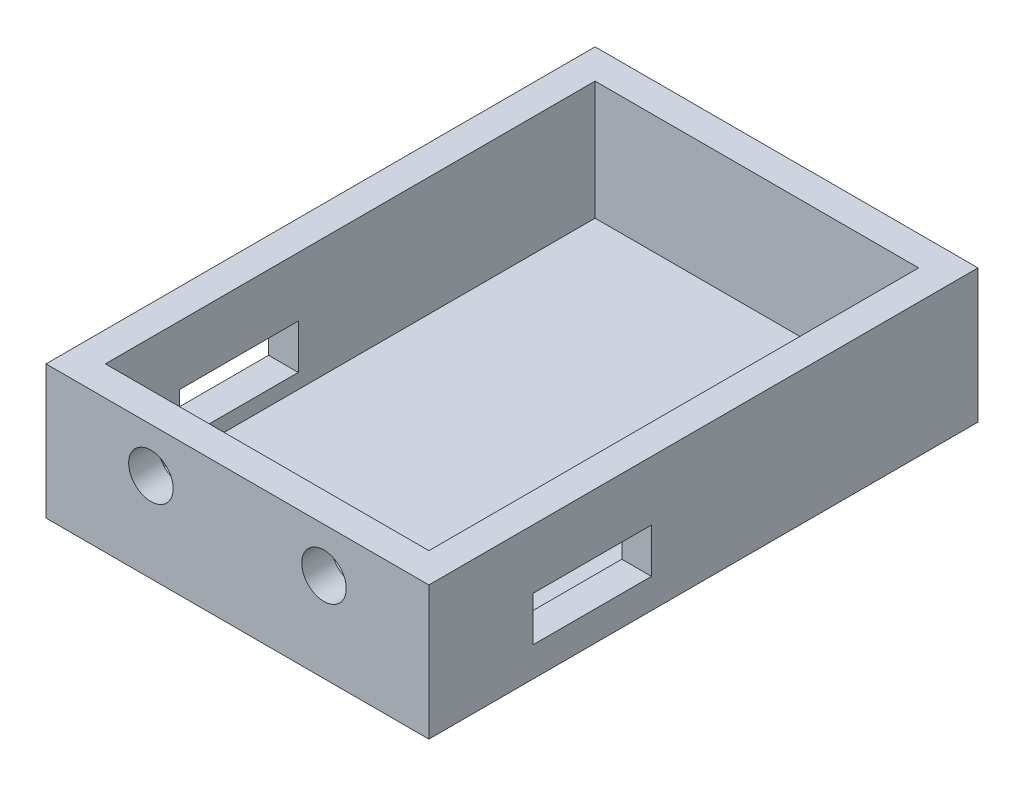
ISO-10303-21;
HEADER;
FILE_DESCRIPTION(('STEP AP214'),'2;1');
FILE_NAME('part.step','',(''),(''),'','','');
FILE_SCHEMA(('AUTOMOTIVE_DESIGN { 1 0 10303 214 1 1 1 1 }'));
ENDSEC;
DATA;
#1=APPLICATION_CONTEXT('core data for automotive mechanical design processes');
#2=APPLICATION_PROTOCOL_DEFINITION('international standard','automotive_design',2000,#1);
#3=PRODUCT_CONTEXT('',#1,'mechanical');
#4=PRODUCT('Part','Part','',(#3));
#5=PRODUCT_RELATED_PRODUCT_CATEGORY('part','',(#4));
#6=PRODUCT_DEFINITION_FORMATION('','',#4);
#7=PRODUCT_DEFINITION_CONTEXT('part definition',#1,'design');
#8=PRODUCT_DEFINITION('design','',#6,#7);
#9=PRODUCT_DEFINITION_SHAPE('','',#8);
#10=(LENGTH_UNIT() NAMED_UNIT(*) SI_UNIT(.MILLI.,.METRE.));
#11=(NAMED_UNIT(*) PLANE_ANGLE_UNIT() SI_UNIT($,.RADIAN.));
#12=(NAMED_UNIT(*) SI_UNIT($,.STERADIAN.) SOLID_ANGLE_UNIT());
#13=UNCERTAINTY_MEASURE_WITH_UNIT(LENGTH_MEASURE(1.E-05),#10,'distance_accuracy_value','');
#14=(GEOMETRIC_REPRESENTATION_CONTEXT(3) GLOBAL_UNCERTAINTY_ASSIGNED_CONTEXT((#13)) GLOBAL_UNIT_ASSIGNED_CONTEXT((#10,
#11,#12)) REPRESENTATION_CONTEXT('',''));
#15=CARTESIAN_POINT('',(0.,0.,0.));
#16=DIRECTION('',(0.,0.,1.));
#17=DIRECTION('',(1.,0.,0.));
#18=AXIS2_PLACEMENT_3D('',#15,#16,#17);
#19=CARTESIAN_POINT('',(0.,1.,0.));
#20=DIRECTION('',(0.,1.,0.));
#21=DIRECTION('',(0.,0.,1.));
#22=AXIS2_PLACEMENT_3D('',#19,#20,#21);
#23=PLANE('',#22);
#24=DIRECTION('',(0.,0.,-1.));
#25=VECTOR('',#24,1.);
#26=CARTESIAN_POINT('',(12.9,1.,18.5));
#27=LINE('',#26,#25);
#28=CARTESIAN_POINT('',(12.9,1.,11.5));
#29=VERTEX_POINT('',#28);
#30=CARTESIAN_POINT('',(12.9,1.,3.5));
#31=VERTEX_POINT('',#30);
#32=EDGE_CURVE('E335',#29,#31,#27,.T.);
#33=ORIENTED_EDGE('',*,*,#32,.T.);
#34=DIRECTION('',(1.,0.,0.));
#35=VECTOR('',#34,1.);
#36=CARTESIAN_POINT('',(10.9,1.,3.5));
#37=LINE('',#36,#35);
#38=CARTESIAN_POINT('',(10.9,1.,3.5));
#39=VERTEX_POINT('',#38);
#40=EDGE_CURVE('E279',#39,#31,#37,.T.);
#41=ORIENTED_EDGE('',*,*,#40,.F.);
#42=DIRECTION('',(0.,0.,-1.));
#43=VECTOR('',#42,1.);
#44=CARTESIAN_POINT('',(10.9,1.,16.5));
#45=LINE('',#44,#43);
#46=CARTESIAN_POINT('',(10.9,1.,11.5));
#47=VERTEX_POINT('',#46);
#48=EDGE_CURVE('E316',#47,#39,#45,.T.);
#49=ORIENTED_EDGE('',*,*,#48,.F.);
#50=DIRECTION('',(1.,0.,0.));
#51=VECTOR('',#50,1.);
#52=CARTESIAN_POINT('',(10.9,1.,11.5));
#53=LINE('',#52,#51);
#54=EDGE_CURVE('E294',#47,#29,#53,.T.);
#55=ORIENTED_EDGE('',*,*,#54,.T.);
#56=EDGE_LOOP('',(#33,#41,#49,#55));
#57=FACE_BOUND('',#56,.T.);
#58=ADVANCED_FACE('F89',(#57),#23,.T.);
#59=DIRECTION('',(-1.,0.,0.));
#60=VECTOR('',#59,1.);
#61=CARTESIAN_POINT('',(0.,1.,3.5));
#62=LINE('',#61,#60);
#63=CARTESIAN_POINT('',(-10.9,1.,3.5));
#64=VERTEX_POINT('',#63);
#65=CARTESIAN_POINT('',(-12.9,1.,3.5));
#66=VERTEX_POINT('',#65);
#67=EDGE_CURVE('E106',#64,#66,#62,.T.);
#68=ORIENTED_EDGE('',*,*,#67,.T.);
#69=DIRECTION('',(0.,0.,1.));
#70=VECTOR('',#69,1.);
#71=CARTESIAN_POINT('',(-12.9,1.,18.5));
#72=LINE('',#71,#70);
#73=CARTESIAN_POINT('',(-12.9,1.,11.5));
#74=VERTEX_POINT('',#73);
#75=EDGE_CURVE('E317',#66,#74,#72,.T.);
#76=ORIENTED_EDGE('',*,*,#75,.T.);
#77=DIRECTION('',(-1.,0.,0.));
#78=VECTOR('',#77,1.);
#79=CARTESIAN_POINT('',(-10.9,1.,11.5));
#80=LINE('',#79,#78);
#81=CARTESIAN_POINT('',(-10.9,1.,11.5));
#82=VERTEX_POINT('',#81);
#83=EDGE_CURVE('E281',#82,#74,#80,.T.);
#84=ORIENTED_EDGE('',*,*,#83,.F.);
#85=DIRECTION('',(0.,0.,1.));
#86=VECTOR('',#85,1.);
#87=CARTESIAN_POINT('',(-10.9,1.,16.5));
#88=LINE('',#87,#86);
#89=EDGE_CURVE('E313',#64,#82,#88,.T.);
#90=ORIENTED_EDGE('',*,*,#89,.F.);
#91=EDGE_LOOP('',(#68,#76,#84,#90));
#92=FACE_BOUND('',#91,.T.);
#93=ADVANCED_FACE('F362',(#92),#23,.T.);
#94=CARTESIAN_POINT('',(-12.9,1.,18.5));
#95=DIRECTION('',(0.,0.,-1.));
#96=DIRECTION('',(-1.,0.,0.));
#97=AXIS2_PLACEMENT_3D('',#94,#95,#96);
#98=PLANE('',#97);
#99=CARTESIAN_POINT('',(5.83092993362655,5.,18.5));
#100=DIRECTION('',(0.,0.,1.));
#101=DIRECTION('',(-1.,0.,0.));
#102=AXIS2_PLACEMENT_3D('',#99,#100,#101);
#103=CIRCLE('',#102,1.5);
#104=CARTESIAN_POINT('',(4.33092993362655,5.,18.5));
#105=VERTEX_POINT('',#104);
#106=EDGE_CURVE('E536',#105,#105,#103,.T.);
#107=ORIENTED_EDGE('',*,*,#106,.F.);
#108=EDGE_LOOP('',(#107));
#109=FACE_BOUND('',#108,.T.);
#110=CARTESIAN_POINT('',(-5.83092993362655,5.,18.5));
#111=DIRECTION('',(0.,0.,1.));
#112=DIRECTION('',(1.,0.,0.));
#113=AXIS2_PLACEMENT_3D('',#110,#111,#112);
#114=CIRCLE('',#113,1.5);
#115=CARTESIAN_POINT('',(-4.33092993362655,5.,18.5));
#116=VERTEX_POINT('',#115);
#117=EDGE_CURVE('E538',#116,#116,#114,.T.);
#118=ORIENTED_EDGE('',*,*,#117,.F.);
#119=EDGE_LOOP('',(#118));
#120=FACE_BOUND('',#119,.T.);
#121=DIRECTION('',(0.,-1.,0.));
#122=VECTOR('',#121,1.);
#123=CARTESIAN_POINT('',(-12.9,1.,18.5));
#124=LINE('',#123,#122);
#125=CARTESIAN_POINT('',(-12.9,8.,18.5));
#126=VERTEX_POINT('',#125);
#127=CARTESIAN_POINT('',(-12.9,-1.,18.5));
#128=VERTEX_POINT('',#127);
#129=EDGE_CURVE('E365',#126,#128,#124,.T.);
#130=ORIENTED_EDGE('',*,*,#129,.T.);
#131=DIRECTION('',(-1.,0.,0.));
#132=VECTOR('',#131,1.);
#133=CARTESIAN_POINT('',(12.9,-1.,18.5));
#134=LINE('',#133,#132);
#135=CARTESIAN_POINT('',(12.9,-1.,18.5));
#136=VERTEX_POINT('',#135);
#137=EDGE_CURVE('E263',#136,#128,#134,.T.);
#138=ORIENTED_EDGE('',*,*,#137,.F.);
#139=DIRECTION('',(0.,-1.,0.));
#140=VECTOR('',#139,1.);
#141=CARTESIAN_POINT('',(12.9,1.,18.5));
#142=LINE('',#141,#140);
#143=CARTESIAN_POINT('',(12.9,8.,18.5));
#144=VERTEX_POINT('',#143);
#145=EDGE_CURVE('E14',#144,#136,#142,.T.);
#146=ORIENTED_EDGE('',*,*,#145,.F.);
#147=DIRECTION('',(1.,0.,0.));
#148=VECTOR('',#147,1.);
#149=CARTESIAN_POINT('',(-12.9,8.,18.5));
#150=LINE('',#149,#148);
#151=EDGE_CURVE('E246',#126,#144,#150,.T.);
#152=ORIENTED_EDGE('',*,*,#151,.F.);
#153=EDGE_LOOP('',(#130,#138,#146,#152));
#154=FACE_BOUND('',#153,.T.);
#155=ADVANCED_FACE('F91',(#109,#120,#154),#98,.F.);
#156=CARTESIAN_POINT('',(12.9,1.,18.5));
#157=DIRECTION('',(-1.,0.,0.));
#158=DIRECTION('',(0.,0.,1.));
#159=AXIS2_PLACEMENT_3D('',#156,#157,#158);
#160=PLANE('',#159);
#161=DIRECTION('',(0.,-1.,0.));
#162=VECTOR('',#161,1.);
#163=CARTESIAN_POINT('',(12.9,4.,11.5));
#164=LINE('',#163,#162);
#165=CARTESIAN_POINT('',(12.9,4.,11.5));
#166=VERTEX_POINT('',#165);
#167=EDGE_CURVE('E114',#166,#29,#164,.T.);
#168=ORIENTED_EDGE('',*,*,#167,.F.);
#169=DIRECTION('',(0.,0.,-1.));
#170=VECTOR('',#169,1.);
#171=CARTESIAN_POINT('',(12.9,4.,18.5));
#172=LINE('',#171,#170);
#173=CARTESIAN_POINT('',(12.9,4.,3.5));
#174=VERTEX_POINT('',#173);
#175=EDGE_CURVE('E247',#166,#174,#172,.T.);
#176=ORIENTED_EDGE('',*,*,#175,.T.);
#177=DIRECTION('',(0.,-1.,0.));
#178=VECTOR('',#177,1.);
#179=CARTESIAN_POINT('',(12.9,4.,3.5));
#180=LINE('',#179,#178);
#181=EDGE_CURVE('E273',#174,#31,#180,.T.);
#182=ORIENTED_EDGE('',*,*,#181,.T.);
#183=ORIENTED_EDGE('',*,*,#32,.F.);
#184=EDGE_LOOP('',(#168,#176,#182,#183));
#185=FACE_BOUND('',#184,.T.);
#186=ORIENTED_EDGE('',*,*,#145,.T.);
#187=DIRECTION('',(0.,0.,1.));
#188=VECTOR('',#187,1.);
#189=CARTESIAN_POINT('',(12.9,-1.,-18.5));
#190=LINE('',#189,#188);
#191=CARTESIAN_POINT('',(12.9,-1.,-18.5));
#192=VERTEX_POINT('',#191);
#193=EDGE_CURVE('E256',#192,#136,#190,.T.);
#194=ORIENTED_EDGE('',*,*,#193,.F.);
#195=DIRECTION('',(0.,-1.,0.));
#196=VECTOR('',#195,1.);
#197=CARTESIAN_POINT('',(12.9,1.,-18.5));
#198=LINE('',#197,#196);
#199=CARTESIAN_POINT('',(12.9,8.,-18.5));
#200=VERTEX_POINT('',#199);
#201=EDGE_CURVE('E98',#200,#192,#198,.T.);
#202=ORIENTED_EDGE('',*,*,#201,.F.);
#203=DIRECTION('',(0.,0.,-1.));
#204=VECTOR('',#203,1.);
#205=CARTESIAN_POINT('',(12.9,8.,18.5));
#206=LINE('',#205,#204);
#207=EDGE_CURVE('E250',#144,#200,#206,.T.);
#208=ORIENTED_EDGE('',*,*,#207,.F.);
#209=EDGE_LOOP('',(#186,#194,#202,#208));
#210=FACE_BOUND('',#209,.T.);
#211=ADVANCED_FACE('F399',(#185,#210),#160,.F.);
#212=CARTESIAN_POINT('',(-12.9,1.,-18.5));
#213=DIRECTION('',(0.,0.,1.));
#214=DIRECTION('',(1.,0.,0.));
#215=AXIS2_PLACEMENT_3D('',#212,#213,#214);
#216=PLANE('',#215);
#217=ORIENTED_EDGE('',*,*,#201,.T.);
#218=DIRECTION('',(1.,0.,0.));
#219=VECTOR('',#218,1.);
#220=CARTESIAN_POINT('',(-12.9,-1.,-18.5));
#221=LINE('',#220,#219);
#222=CARTESIAN_POINT('',(-12.9,-1.,-18.5));
#223=VERTEX_POINT('',#222);
#224=EDGE_CURVE('E269',#223,#192,#221,.T.);
#225=ORIENTED_EDGE('',*,*,#224,.F.);
#226=DIRECTION('',(0.,-1.,0.));
#227=VECTOR('',#226,1.);
#228=CARTESIAN_POINT('',(-12.9,1.,-18.5));
#229=LINE('',#228,#227);
#230=CARTESIAN_POINT('',(-12.9,8.,-18.5));
#231=VERTEX_POINT('',#230);
#232=EDGE_CURVE('E419',#231,#223,#229,.T.);
#233=ORIENTED_EDGE('',*,*,#232,.F.);
#234=DIRECTION('',(-1.,0.,0.));
#235=VECTOR('',#234,1.);
#236=CARTESIAN_POINT('',(-12.9,8.,-18.5));
#237=LINE('',#236,#235);
#238=EDGE_CURVE('E253',#200,#231,#237,.T.);
#239=ORIENTED_EDGE('',*,*,#238,.F.);
#240=EDGE_LOOP('',(#217,#225,#233,#239));
#241=FACE_BOUND('',#240,.T.);
#242=ADVANCED_FACE('F396',(#241),#216,.F.);
#243=CARTESIAN_POINT('',(-12.9,1.,18.5));
#244=DIRECTION('',(1.,0.,0.));
#245=DIRECTION('',(0.,0.,-1.));
#246=AXIS2_PLACEMENT_3D('',#243,#244,#245);
#247=PLANE('',#246);
#248=ORIENTED_EDGE('',*,*,#129,.F.);
#249=DIRECTION('',(0.,0.,1.));
#250=VECTOR('',#249,1.);
#251=CARTESIAN_POINT('',(-12.9,8.,18.5));
#252=LINE('',#251,#250);
#253=EDGE_CURVE('E243',#231,#126,#252,.T.);
#254=ORIENTED_EDGE('',*,*,#253,.F.);
#255=ORIENTED_EDGE('',*,*,#232,.T.);
#256=DIRECTION('',(0.,0.,-1.));
#257=VECTOR('',#256,1.);
#258=CARTESIAN_POINT('',(-12.9,-1.,18.5));
#259=LINE('',#258,#257);
#260=EDGE_CURVE('E266',#128,#223,#259,.T.);
#261=ORIENTED_EDGE('',*,*,#260,.F.);
#262=EDGE_LOOP('',(#248,#254,#255,#261));
#263=FACE_BOUND('',#262,.T.);
#264=DIRECTION('',(0.,0.,1.));
#265=VECTOR('',#264,1.);
#266=CARTESIAN_POINT('',(-12.9,4.,18.5));
#267=LINE('',#266,#265);
#268=CARTESIAN_POINT('',(-12.9,4.,3.5));
#269=VERTEX_POINT('',#268);
#270=CARTESIAN_POINT('',(-12.9,4.,11.5));
#271=VERTEX_POINT('',#270);
#272=EDGE_CURVE('E237',#269,#271,#267,.T.);
#273=ORIENTED_EDGE('',*,*,#272,.T.);
#274=DIRECTION('',(0.,-1.,0.));
#275=VECTOR('',#274,1.);
#276=CARTESIAN_POINT('',(-12.9,4.,11.5));
#277=LINE('',#276,#275);
#278=EDGE_CURVE('E307',#271,#74,#277,.T.);
#279=ORIENTED_EDGE('',*,*,#278,.T.);
#280=ORIENTED_EDGE('',*,*,#75,.F.);
#281=DIRECTION('',(0.,-1.,0.));
#282=VECTOR('',#281,1.);
#283=CARTESIAN_POINT('',(-12.9,4.,3.5));
#284=LINE('',#283,#282);
#285=EDGE_CURVE('E272',#269,#66,#284,.T.);
#286=ORIENTED_EDGE('',*,*,#285,.F.);
#287=EDGE_LOOP('',(#273,#279,#280,#286));
#288=FACE_BOUND('',#287,.T.);
#289=ADVANCED_FACE('F366',(#263,#288),#247,.F.);
#290=CARTESIAN_POINT('',(10.9,1.,16.5));
#291=DIRECTION('',(-1.,0.,0.));
#292=DIRECTION('',(0.,0.,1.));
#293=AXIS2_PLACEMENT_3D('',#290,#291,#292);
#294=PLANE('',#293);
#295=DIRECTION('',(0.,0.,-1.));
#296=VECTOR('',#295,1.);
#297=CARTESIAN_POINT('',(10.9,4.,16.5));
#298=LINE('',#297,#296);
#299=CARTESIAN_POINT('',(10.9,4.,11.5));
#300=VERTEX_POINT('',#299);
#301=CARTESIAN_POINT('',(10.9,4.,3.5));
#302=VERTEX_POINT('',#301);
#303=EDGE_CURVE('E226',#300,#302,#298,.T.);
#304=ORIENTED_EDGE('',*,*,#303,.F.);
#305=DIRECTION('',(0.,-1.,0.));
#306=VECTOR('',#305,1.);
#307=CARTESIAN_POINT('',(10.9,4.,11.5));
#308=LINE('',#307,#306);
#309=EDGE_CURVE('E347',#300,#47,#308,.T.);
#310=ORIENTED_EDGE('',*,*,#309,.T.);
#311=ORIENTED_EDGE('',*,*,#48,.T.);
#312=DIRECTION('',(0.,-1.,0.));
#313=VECTOR('',#312,1.);
#314=CARTESIAN_POINT('',(10.9,4.,3.5));
#315=LINE('',#314,#313);
#316=EDGE_CURVE('E277',#302,#39,#315,.T.);
#317=ORIENTED_EDGE('',*,*,#316,.F.);
#318=EDGE_LOOP('',(#304,#310,#311,#317));
#319=FACE_BOUND('',#318,.T.);
#320=DIRECTION('',(0.,0.,-1.));
#321=VECTOR('',#320,1.);
#322=CARTESIAN_POINT('',(10.9,0.,16.5));
#323=LINE('',#322,#321);
#324=CARTESIAN_POINT('',(10.9,0.,16.5));
#325=VERTEX_POINT('',#324);
#326=CARTESIAN_POINT('',(10.9,0.,-16.5));
#327=VERTEX_POINT('',#326);
#328=EDGE_CURVE('E310',#325,#327,#323,.T.);
#329=ORIENTED_EDGE('',*,*,#328,.F.);
#330=DIRECTION('',(0.,-1.,0.));
#331=VECTOR('',#330,1.);
#332=CARTESIAN_POINT('',(10.9,1.,16.5));
#333=LINE('',#332,#331);
#334=CARTESIAN_POINT('',(10.9,8.,16.5));
#335=VERTEX_POINT('',#334);
#336=EDGE_CURVE('E217',#335,#325,#333,.T.);
#337=ORIENTED_EDGE('',*,*,#336,.F.);
#338=DIRECTION('',(0.,0.,-1.));
#339=VECTOR('',#338,1.);
#340=CARTESIAN_POINT('',(10.9,8.,16.5));
#341=LINE('',#340,#339);
#342=CARTESIAN_POINT('',(10.9,8.,-16.5));
#343=VERTEX_POINT('',#342);
#344=EDGE_CURVE('E230',#335,#343,#341,.T.);
#345=ORIENTED_EDGE('',*,*,#344,.T.);
#346=DIRECTION('',(0.,-1.,0.));
#347=VECTOR('',#346,1.);
#348=CARTESIAN_POINT('',(10.9,1.,-16.5));
#349=LINE('',#348,#347);
#350=EDGE_CURVE('E332',#343,#327,#349,.T.);
#351=ORIENTED_EDGE('',*,*,#350,.T.);
#352=EDGE_LOOP('',(#329,#337,#345,#351));
#353=FACE_BOUND('',#352,.T.);
#354=ADVANCED_FACE('F392',(#319,#353),#294,.T.);
#355=CARTESIAN_POINT('',(-10.9,1.,-16.5));
#356=DIRECTION('',(0.,0.,1.));
#357=DIRECTION('',(1.,0.,0.));
#358=AXIS2_PLACEMENT_3D('',#355,#356,#357);
#359=PLANE('',#358);
#360=DIRECTION('',(-1.,0.,0.));
#361=VECTOR('',#360,1.);
#362=CARTESIAN_POINT('',(-10.9,0.,-16.5));
#363=LINE('',#362,#361);
#364=CARTESIAN_POINT('',(-10.9,0.,-16.5));
#365=VERTEX_POINT('',#364);
#366=EDGE_CURVE('E324',#327,#365,#363,.T.);
#367=ORIENTED_EDGE('',*,*,#366,.F.);
#368=ORIENTED_EDGE('',*,*,#350,.F.);
#369=DIRECTION('',(-1.,0.,0.));
#370=VECTOR('',#369,1.);
#371=CARTESIAN_POINT('',(-10.9,8.,-16.5));
#372=LINE('',#371,#370);
#373=CARTESIAN_POINT('',(-10.9,8.,-16.5));
#374=VERTEX_POINT('',#373);
#375=EDGE_CURVE('E232',#343,#374,#372,.T.);
#376=ORIENTED_EDGE('',*,*,#375,.T.);
#377=DIRECTION('',(0.,-1.,0.));
#378=VECTOR('',#377,1.);
#379=CARTESIAN_POINT('',(-10.9,1.,-16.5));
#380=LINE('',#379,#378);
#381=EDGE_CURVE('E216',#374,#365,#380,.T.);
#382=ORIENTED_EDGE('',*,*,#381,.T.);
#383=EDGE_LOOP('',(#367,#368,#376,#382));
#384=FACE_BOUND('',#383,.T.);
#385=ADVANCED_FACE('F446',(#384),#359,.T.);
#386=CARTESIAN_POINT('',(-10.9,1.,16.5));
#387=DIRECTION('',(1.,0.,0.));
#388=DIRECTION('',(0.,0.,-1.));
#389=AXIS2_PLACEMENT_3D('',#386,#387,#388);
#390=PLANE('',#389);
#391=DIRECTION('',(0.,0.,1.));
#392=VECTOR('',#391,1.);
#393=CARTESIAN_POINT('',(-10.9,8.,16.5));
#394=LINE('',#393,#392);
#395=CARTESIAN_POINT('',(-10.9,8.,16.5));
#396=VERTEX_POINT('',#395);
#397=EDGE_CURVE('E220',#374,#396,#394,.T.);
#398=ORIENTED_EDGE('',*,*,#397,.T.);
#399=DIRECTION('',(0.,-1.,0.));
#400=VECTOR('',#399,1.);
#401=CARTESIAN_POINT('',(-10.9,1.,16.5));
#402=LINE('',#401,#400);
#403=CARTESIAN_POINT('',(-10.9,0.,16.5));
#404=VERTEX_POINT('',#403);
#405=EDGE_CURVE('E205',#396,#404,#402,.T.);
#406=ORIENTED_EDGE('',*,*,#405,.T.);
#407=DIRECTION('',(0.,0.,1.));
#408=VECTOR('',#407,1.);
#409=CARTESIAN_POINT('',(-10.9,0.,16.5));
#410=LINE('',#409,#408);
#411=EDGE_CURVE('E327',#365,#404,#410,.T.);
#412=ORIENTED_EDGE('',*,*,#411,.F.);
#413=ORIENTED_EDGE('',*,*,#381,.F.);
#414=EDGE_LOOP('',(#398,#406,#412,#413));
#415=FACE_BOUND('',#414,.T.);
#416=DIRECTION('',(0.,-1.,0.));
#417=VECTOR('',#416,1.);
#418=CARTESIAN_POINT('',(-10.9,4.,11.5));
#419=LINE('',#418,#417);
#420=CARTESIAN_POINT('',(-10.9,4.,11.5));
#421=VERTEX_POINT('',#420);
#422=EDGE_CURVE('E296',#421,#82,#419,.T.);
#423=ORIENTED_EDGE('',*,*,#422,.F.);
#424=DIRECTION('',(0.,0.,1.));
#425=VECTOR('',#424,1.);
#426=CARTESIAN_POINT('',(-10.9,4.,16.5));
#427=LINE('',#426,#425);
#428=CARTESIAN_POINT('',(-10.9,4.,3.5));
#429=VERTEX_POINT('',#428);
#430=EDGE_CURVE('E238',#429,#421,#427,.T.);
#431=ORIENTED_EDGE('',*,*,#430,.F.);
#432=DIRECTION('',(0.,-1.,0.));
#433=VECTOR('',#432,1.);
#434=CARTESIAN_POINT('',(-10.9,4.,3.5));
#435=LINE('',#434,#433);
#436=EDGE_CURVE('E285',#429,#64,#435,.T.);
#437=ORIENTED_EDGE('',*,*,#436,.T.);
#438=ORIENTED_EDGE('',*,*,#89,.T.);
#439=EDGE_LOOP('',(#423,#431,#437,#438));
#440=FACE_BOUND('',#439,.T.);
#441=ADVANCED_FACE('F221',(#415,#440),#390,.T.);
#442=CARTESIAN_POINT('',(-10.9,1.,16.5));
#443=DIRECTION('',(0.,0.,-1.));
#444=DIRECTION('',(-1.,0.,0.));
#445=AXIS2_PLACEMENT_3D('',#442,#443,#444);
#446=PLANE('',#445);
#447=CARTESIAN_POINT('',(5.83092993362655,5.,16.5));
#448=DIRECTION('',(0.,0.,-1.));
#449=DIRECTION('',(-1.,0.,0.));
#450=AXIS2_PLACEMENT_3D('',#447,#448,#449);
#451=CIRCLE('',#450,1.5);
#452=CARTESIAN_POINT('',(4.33092993362655,5.,16.5));
#453=VERTEX_POINT('',#452);
#454=EDGE_CURVE('E93',#453,#453,#451,.T.);
#455=ORIENTED_EDGE('',*,*,#454,.F.);
#456=EDGE_LOOP('',(#455));
#457=FACE_BOUND('',#456,.T.);
#458=CARTESIAN_POINT('',(-5.83092993362655,5.,16.5));
#459=DIRECTION('',(0.,0.,-1.));
#460=DIRECTION('',(-1.,0.,0.));
#461=AXIS2_PLACEMENT_3D('',#458,#459,#460);
#462=CIRCLE('',#461,1.5);
#463=CARTESIAN_POINT('',(-7.33092993362655,5.,16.5));
#464=VERTEX_POINT('',#463);
#465=EDGE_CURVE('E240',#464,#464,#462,.T.);
#466=ORIENTED_EDGE('',*,*,#465,.F.);
#467=EDGE_LOOP('',(#466));
#468=FACE_BOUND('',#467,.T.);
#469=DIRECTION('',(1.,0.,0.));
#470=VECTOR('',#469,1.);
#471=CARTESIAN_POINT('',(-10.9,0.,16.5));
#472=LINE('',#471,#470);
#473=EDGE_CURVE('E212',#404,#325,#472,.T.);
#474=ORIENTED_EDGE('',*,*,#473,.F.);
#475=ORIENTED_EDGE('',*,*,#405,.F.);
#476=DIRECTION('',(1.,0.,0.));
#477=VECTOR('',#476,1.);
#478=CARTESIAN_POINT('',(-10.9,8.,16.5));
#479=LINE('',#478,#477);
#480=EDGE_CURVE('E209',#396,#335,#479,.T.);
#481=ORIENTED_EDGE('',*,*,#480,.T.);
#482=ORIENTED_EDGE('',*,*,#336,.T.);
#483=EDGE_LOOP('',(#474,#475,#481,#482));
#484=FACE_BOUND('',#483,.T.);
#485=ADVANCED_FACE('F207',(#457,#468,#484),#446,.T.);
#486=CARTESIAN_POINT('',(-10.9,4.,11.5));
#487=DIRECTION('',(0.,0.,1.));
#488=DIRECTION('',(1.,0.,0.));
#489=AXIS2_PLACEMENT_3D('',#486,#487,#488);
#490=PLANE('',#489);
#491=ORIENTED_EDGE('',*,*,#83,.T.);
#492=ORIENTED_EDGE('',*,*,#278,.F.);
#493=DIRECTION('',(-1.,0.,0.));
#494=VECTOR('',#493,1.);
#495=CARTESIAN_POINT('',(-10.9,4.,11.5));
#496=LINE('',#495,#494);
#497=EDGE_CURVE('E291',#421,#271,#496,.T.);
#498=ORIENTED_EDGE('',*,*,#497,.F.);
#499=ORIENTED_EDGE('',*,*,#422,.T.);
#500=EDGE_LOOP('',(#491,#492,#498,#499));
#501=FACE_BOUND('',#500,.T.);
#502=ADVANCED_FACE('F357',(#501),#490,.F.);
#503=CARTESIAN_POINT('',(10.9,4.,11.5));
#504=DIRECTION('',(0.,0.,-1.));
#505=DIRECTION('',(-1.,0.,0.));
#506=AXIS2_PLACEMENT_3D('',#503,#504,#505);
#507=PLANE('',#506);
#508=ORIENTED_EDGE('',*,*,#54,.F.);
#509=ORIENTED_EDGE('',*,*,#309,.F.);
#510=DIRECTION('',(1.,0.,0.));
#511=VECTOR('',#510,1.);
#512=CARTESIAN_POINT('',(10.9,4.,11.5));
#513=LINE('',#512,#511);
#514=EDGE_CURVE('E293',#300,#166,#513,.T.);
#515=ORIENTED_EDGE('',*,*,#514,.T.);
#516=ORIENTED_EDGE('',*,*,#167,.T.);
#517=EDGE_LOOP('',(#508,#509,#515,#516));
#518=FACE_BOUND('',#517,.T.);
#519=ADVANCED_FACE('F374',(#518),#507,.T.);
#520=CARTESIAN_POINT('',(0.,4.,3.5));
#521=DIRECTION('',(0.,0.,1.));
#522=DIRECTION('',(1.,0.,0.));
#523=AXIS2_PLACEMENT_3D('',#520,#521,#522);
#524=PLANE('',#523);
#525=ORIENTED_EDGE('',*,*,#67,.F.);
#526=ORIENTED_EDGE('',*,*,#436,.F.);
#527=DIRECTION('',(-1.,0.,0.));
#528=VECTOR('',#527,1.);
#529=CARTESIAN_POINT('',(0.,4.,3.5));
#530=LINE('',#529,#528);
#531=EDGE_CURVE('E287',#429,#269,#530,.T.);
#532=ORIENTED_EDGE('',*,*,#531,.T.);
#533=ORIENTED_EDGE('',*,*,#285,.T.);
#534=EDGE_LOOP('',(#525,#526,#532,#533));
#535=FACE_BOUND('',#534,.T.);
#536=ADVANCED_FACE('F371',(#535),#524,.T.);
#537=CARTESIAN_POINT('',(10.9,4.,3.5));
#538=DIRECTION('',(0.,0.,-1.));
#539=DIRECTION('',(-1.,0.,0.));
#540=AXIS2_PLACEMENT_3D('',#537,#538,#539);
#541=PLANE('',#540);
#542=ORIENTED_EDGE('',*,*,#40,.T.);
#543=ORIENTED_EDGE('',*,*,#181,.F.);
#544=DIRECTION('',(1.,0.,0.));
#545=VECTOR('',#544,1.);
#546=CARTESIAN_POINT('',(10.9,4.,3.5));
#547=LINE('',#546,#545);
#548=EDGE_CURVE('E276',#302,#174,#547,.T.);
#549=ORIENTED_EDGE('',*,*,#548,.F.);
#550=ORIENTED_EDGE('',*,*,#316,.T.);
#551=EDGE_LOOP('',(#542,#543,#549,#550));
#552=FACE_BOUND('',#551,.T.);
#553=ADVANCED_FACE('F373',(#552),#541,.F.);
#554=CARTESIAN_POINT('',(0.,0.,0.));
#555=DIRECTION('',(0.,-1.,0.));
#556=DIRECTION('',(0.,0.,-1.));
#557=AXIS2_PLACEMENT_3D('',#554,#555,#556);
#558=PLANE('',#557);
#559=ORIENTED_EDGE('',*,*,#328,.T.);
#560=ORIENTED_EDGE('',*,*,#366,.T.);
#561=ORIENTED_EDGE('',*,*,#411,.T.);
#562=ORIENTED_EDGE('',*,*,#473,.T.);
#563=EDGE_LOOP('',(#559,#560,#561,#562));
#564=FACE_BOUND('',#563,.T.);
#565=ADVANCED_FACE('F380',(#564),#558,.F.);
#566=CARTESIAN_POINT('',(0.,-1.,0.));
#567=DIRECTION('',(0.,-1.,0.));
#568=DIRECTION('',(0.,0.,-1.));
#569=AXIS2_PLACEMENT_3D('',#566,#567,#568);
#570=PLANE('',#569);
#571=ORIENTED_EDGE('',*,*,#193,.T.);
#572=ORIENTED_EDGE('',*,*,#137,.T.);
#573=ORIENTED_EDGE('',*,*,#260,.T.);
#574=ORIENTED_EDGE('',*,*,#224,.T.);
#575=EDGE_LOOP('',(#571,#572,#573,#574));
#576=FACE_BOUND('',#575,.T.);
#577=ADVANCED_FACE('F416',(#576),#570,.T.);
#578=CARTESIAN_POINT('',(0.,4.,0.));
#579=DIRECTION('',(0.,-1.,0.));
#580=DIRECTION('',(0.,0.,-1.));
#581=AXIS2_PLACEMENT_3D('',#578,#579,#580);
#582=PLANE('',#581);
#583=ORIENTED_EDGE('',*,*,#497,.T.);
#584=ORIENTED_EDGE('',*,*,#272,.F.);
#585=ORIENTED_EDGE('',*,*,#531,.F.);
#586=ORIENTED_EDGE('',*,*,#430,.T.);
#587=EDGE_LOOP('',(#583,#584,#585,#586));
#588=FACE_BOUND('',#587,.T.);
#589=ADVANCED_FACE('F370',(#588),#582,.T.);
#590=CARTESIAN_POINT('',(0.,8.,0.));
#591=DIRECTION('',(0.,-1.,0.));
#592=DIRECTION('',(0.,0.,-1.));
#593=AXIS2_PLACEMENT_3D('',#590,#591,#592);
#594=PLANE('',#593);
#595=ORIENTED_EDGE('',*,*,#253,.T.);
#596=ORIENTED_EDGE('',*,*,#151,.T.);
#597=ORIENTED_EDGE('',*,*,#207,.T.);
#598=ORIENTED_EDGE('',*,*,#238,.T.);
#599=EDGE_LOOP('',(#595,#596,#597,#598));
#600=FACE_BOUND('',#599,.T.);
#601=ORIENTED_EDGE('',*,*,#397,.F.);
#602=ORIENTED_EDGE('',*,*,#375,.F.);
#603=ORIENTED_EDGE('',*,*,#344,.F.);
#604=ORIENTED_EDGE('',*,*,#480,.F.);
#605=EDGE_LOOP('',(#601,#602,#603,#604));
#606=FACE_BOUND('',#605,.T.);
#607=ADVANCED_FACE('F228',(#600,#606),#594,.F.);
#608=ORIENTED_EDGE('',*,*,#175,.F.);
#609=ORIENTED_EDGE('',*,*,#514,.F.);
#610=ORIENTED_EDGE('',*,*,#303,.T.);
#611=ORIENTED_EDGE('',*,*,#548,.T.);
#612=EDGE_LOOP('',(#608,#609,#610,#611));
#613=FACE_BOUND('',#612,.T.);
#614=ADVANCED_FACE('F424',(#613),#582,.T.);
#615=CARTESIAN_POINT('',(-5.83092993362655,5.,14.5));
#616=DIRECTION('',(0.,0.,1.));
#617=DIRECTION('',(1.,0.,0.));
#618=AXIS2_PLACEMENT_3D('',#615,#616,#617);
#619=CYLINDRICAL_SURFACE('',#618,1.5);
#620=ORIENTED_EDGE('',*,*,#465,.T.);
#621=EDGE_LOOP('',(#620));
#622=FACE_BOUND('',#621,.T.);
#623=ORIENTED_EDGE('',*,*,#117,.T.);
#624=EDGE_LOOP('',(#623));
#625=FACE_BOUND('',#624,.T.);
#626=ADVANCED_FACE('F430',(#622,#625),#619,.F.);
#627=CARTESIAN_POINT('',(5.83092993362655,5.,14.5));
#628=DIRECTION('',(0.,0.,1.));
#629=DIRECTION('',(1.,0.,0.));
#630=AXIS2_PLACEMENT_3D('',#627,#628,#629);
#631=CYLINDRICAL_SURFACE('',#630,1.5);
#632=ORIENTED_EDGE('',*,*,#454,.T.);
#633=EDGE_LOOP('',(#632));
#634=FACE_BOUND('',#633,.T.);
#635=ORIENTED_EDGE('',*,*,#106,.T.);
#636=EDGE_LOOP('',(#635));
#637=FACE_BOUND('',#636,.T.);
#638=ADVANCED_FACE('F519',(#634,#637),#631,.F.);
#639=CLOSED_SHELL('',(#58,#93,#155,#211,#242,#289,#354,#385,#441,#485,#502,#519,#536,#553,#565,
#577,#589,#607,#614,#626,#638));
#640=MANIFOLD_SOLID_BREP('B2',#639);
#641=ADVANCED_BREP_SHAPE_REPRESENTATION('',(#18,#640),#14);
#642=SHAPE_DEFINITION_REPRESENTATION(#9,#641);
ENDSEC;
END-ISO-10303-21;
